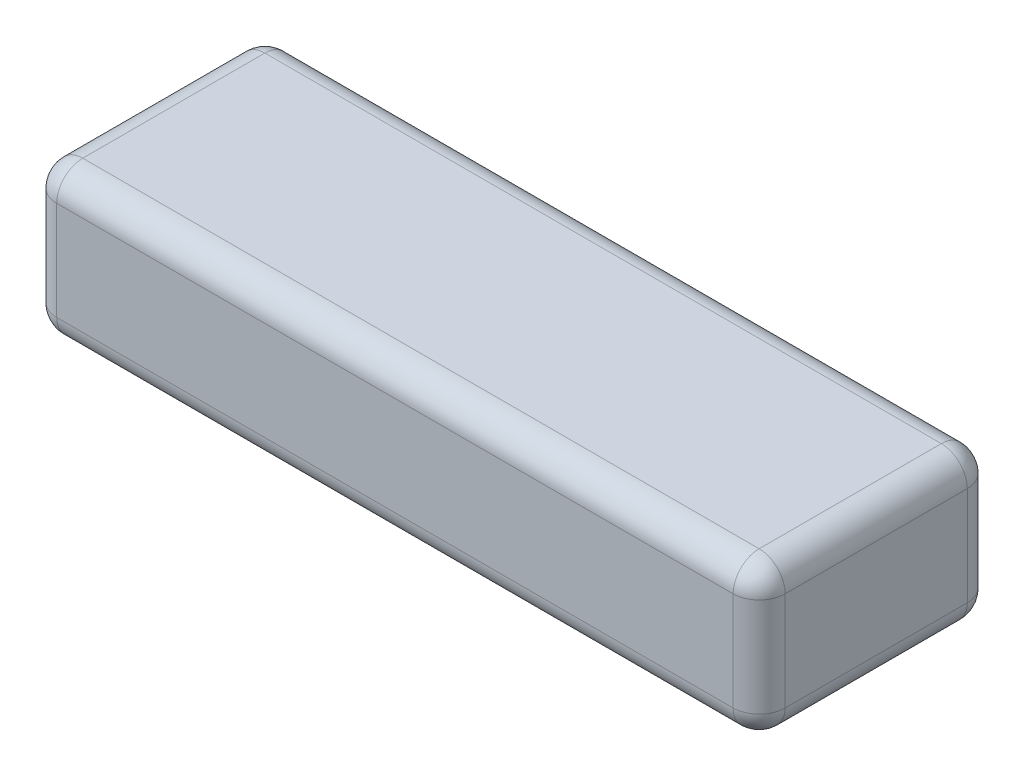
ISO-10303-21;
HEADER;
FILE_DESCRIPTION(('STEP AP214'),'2;1');
FILE_NAME('part.step','',(''),(''),'','','');
FILE_SCHEMA(('AUTOMOTIVE_DESIGN { 1 0 10303 214 1 1 1 1 }'));
ENDSEC;
DATA;
#1=APPLICATION_CONTEXT('core data for automotive mechanical design processes');
#2=APPLICATION_PROTOCOL_DEFINITION('international standard','automotive_design',2000,#1);
#3=PRODUCT_CONTEXT('',#1,'mechanical');
#4=PRODUCT('Part','Part','',(#3));
#5=PRODUCT_RELATED_PRODUCT_CATEGORY('part','',(#4));
#6=PRODUCT_DEFINITION_FORMATION('','',#4);
#7=PRODUCT_DEFINITION_CONTEXT('part definition',#1,'design');
#8=PRODUCT_DEFINITION('design','',#6,#7);
#9=PRODUCT_DEFINITION_SHAPE('','',#8);
#10=(LENGTH_UNIT() NAMED_UNIT(*) SI_UNIT(.MILLI.,.METRE.));
#11=(NAMED_UNIT(*) PLANE_ANGLE_UNIT() SI_UNIT($,.RADIAN.));
#12=(NAMED_UNIT(*) SI_UNIT($,.STERADIAN.) SOLID_ANGLE_UNIT());
#13=UNCERTAINTY_MEASURE_WITH_UNIT(LENGTH_MEASURE(1.E-05),#10,'distance_accuracy_value','');
#14=(GEOMETRIC_REPRESENTATION_CONTEXT(3) GLOBAL_UNCERTAINTY_ASSIGNED_CONTEXT((#13)) GLOBAL_UNIT_ASSIGNED_CONTEXT((#10,
#11,#12)) REPRESENTATION_CONTEXT('',''));
#15=CARTESIAN_POINT('',(0.,0.,0.));
#16=DIRECTION('',(0.,0.,1.));
#17=DIRECTION('',(1.,0.,0.));
#18=AXIS2_PLACEMENT_3D('',#15,#16,#17);
#19=CARTESIAN_POINT('',(-70.,29.,22.5));
#20=DIRECTION('',(1.,0.,0.));
#21=DIRECTION('',(0.,0.,-1.));
#22=AXIS2_PLACEMENT_3D('',#19,#20,#21);
#23=PLANE('',#22);
#24=DIRECTION('',(0.,0.,1.));
#25=VECTOR('',#24,1.);
#26=CARTESIAN_POINT('',(-70.,24.,-22.5));
#27=LINE('',#26,#25);
#28=CARTESIAN_POINT('',(-70.,24.,17.5));
#29=VERTEX_POINT('',#28);
#30=CARTESIAN_POINT('',(-70.,24.,-17.5));
#31=VERTEX_POINT('',#30);
#32=EDGE_CURVE('E276',#29,#31,#27,.F.);
#33=ORIENTED_EDGE('',*,*,#32,.T.);
#34=DIRECTION('',(0.,-1.,0.));
#35=VECTOR('',#34,1.);
#36=CARTESIAN_POINT('',(-70.,29.,-17.5));
#37=LINE('',#36,#35);
#38=CARTESIAN_POINT('',(-70.,5.,-17.5));
#39=VERTEX_POINT('',#38);
#40=EDGE_CURVE('E156',#31,#39,#37,.T.);
#41=ORIENTED_EDGE('',*,*,#40,.T.);
#42=DIRECTION('',(0.,0.,1.));
#43=VECTOR('',#42,1.);
#44=CARTESIAN_POINT('',(-70.,5.,22.5));
#45=LINE('',#44,#43);
#46=CARTESIAN_POINT('',(-70.,5.,17.5));
#47=VERTEX_POINT('',#46);
#48=EDGE_CURVE('E283',#39,#47,#45,.T.);
#49=ORIENTED_EDGE('',*,*,#48,.T.);
#50=DIRECTION('',(0.,-1.,0.));
#51=VECTOR('',#50,1.);
#52=CARTESIAN_POINT('',(-70.,29.,17.5));
#53=LINE('',#52,#51);
#54=EDGE_CURVE('E278',#47,#29,#53,.F.);
#55=ORIENTED_EDGE('',*,*,#54,.T.);
#56=EDGE_LOOP('',(#33,#41,#49,#55));
#57=FACE_BOUND('',#56,.T.);
#58=ADVANCED_FACE('F35',(#57),#23,.F.);
#59=CARTESIAN_POINT('',(70.,29.,22.5));
#60=DIRECTION('',(0.,0.,-1.));
#61=DIRECTION('',(-1.,0.,0.));
#62=AXIS2_PLACEMENT_3D('',#59,#60,#61);
#63=PLANE('',#62);
#64=DIRECTION('',(0.,-1.,0.));
#65=VECTOR('',#64,1.);
#66=CARTESIAN_POINT('',(-65.,29.,22.5));
#67=LINE('',#66,#65);
#68=CARTESIAN_POINT('',(-65.,24.,22.5));
#69=VERTEX_POINT('',#68);
#70=CARTESIAN_POINT('',(-65.,5.,22.5));
#71=VERTEX_POINT('',#70);
#72=EDGE_CURVE('E232',#69,#71,#67,.T.);
#73=ORIENTED_EDGE('',*,*,#72,.T.);
#74=DIRECTION('',(1.,0.,0.));
#75=VECTOR('',#74,1.);
#76=CARTESIAN_POINT('',(70.,5.,22.5));
#77=LINE('',#76,#75);
#78=CARTESIAN_POINT('',(65.,5.,22.5));
#79=VERTEX_POINT('',#78);
#80=EDGE_CURVE('E235',#71,#79,#77,.T.);
#81=ORIENTED_EDGE('',*,*,#80,.T.);
#82=DIRECTION('',(0.,-1.,0.));
#83=VECTOR('',#82,1.);
#84=CARTESIAN_POINT('',(65.,29.,22.5));
#85=LINE('',#84,#83);
#86=CARTESIAN_POINT('',(65.,24.,22.5));
#87=VERTEX_POINT('',#86);
#88=EDGE_CURVE('E214',#79,#87,#85,.F.);
#89=ORIENTED_EDGE('',*,*,#88,.T.);
#90=DIRECTION('',(1.,0.,0.));
#91=VECTOR('',#90,1.);
#92=CARTESIAN_POINT('',(-70.,24.,22.5));
#93=LINE('',#92,#91);
#94=EDGE_CURVE('E229',#87,#69,#93,.F.);
#95=ORIENTED_EDGE('',*,*,#94,.T.);
#96=EDGE_LOOP('',(#73,#81,#89,#95));
#97=FACE_BOUND('',#96,.T.);
#98=ADVANCED_FACE('F325',(#97),#63,.F.);
#99=CARTESIAN_POINT('',(70.,29.,22.5));
#100=DIRECTION('',(-1.,0.,0.));
#101=DIRECTION('',(0.,0.,1.));
#102=AXIS2_PLACEMENT_3D('',#99,#100,#101);
#103=PLANE('',#102);
#104=DIRECTION('',(0.,0.,-1.));
#105=VECTOR('',#104,1.);
#106=CARTESIAN_POINT('',(70.,5.,22.5));
#107=LINE('',#106,#105);
#108=CARTESIAN_POINT('',(70.,5.,17.5));
#109=VERTEX_POINT('',#108);
#110=CARTESIAN_POINT('',(70.,5.,-17.5));
#111=VERTEX_POINT('',#110);
#112=EDGE_CURVE('E219',#109,#111,#107,.T.);
#113=ORIENTED_EDGE('',*,*,#112,.T.);
#114=DIRECTION('',(0.,-1.,0.));
#115=VECTOR('',#114,1.);
#116=CARTESIAN_POINT('',(70.,29.,-17.5));
#117=LINE('',#116,#115);
#118=CARTESIAN_POINT('',(70.,24.,-17.5));
#119=VERTEX_POINT('',#118);
#120=EDGE_CURVE('E222',#111,#119,#117,.F.);
#121=ORIENTED_EDGE('',*,*,#120,.T.);
#122=DIRECTION('',(0.,0.,-1.));
#123=VECTOR('',#122,1.);
#124=CARTESIAN_POINT('',(70.,24.,22.5));
#125=LINE('',#124,#123);
#126=CARTESIAN_POINT('',(70.,24.,17.5));
#127=VERTEX_POINT('',#126);
#128=EDGE_CURVE('E220',#119,#127,#125,.F.);
#129=ORIENTED_EDGE('',*,*,#128,.T.);
#130=DIRECTION('',(0.,-1.,0.));
#131=VECTOR('',#130,1.);
#132=CARTESIAN_POINT('',(70.,29.,17.5));
#133=LINE('',#132,#131);
#134=EDGE_CURVE('E216',#127,#109,#133,.T.);
#135=ORIENTED_EDGE('',*,*,#134,.T.);
#136=EDGE_LOOP('',(#113,#121,#129,#135));
#137=FACE_BOUND('',#136,.T.);
#138=ADVANCED_FACE('F329',(#137),#103,.F.);
#139=CARTESIAN_POINT('',(70.,29.,-22.5));
#140=DIRECTION('',(0.,0.,1.));
#141=DIRECTION('',(1.,0.,0.));
#142=AXIS2_PLACEMENT_3D('',#139,#140,#141);
#143=PLANE('',#142);
#144=DIRECTION('',(0.,-1.,0.));
#145=VECTOR('',#144,1.);
#146=CARTESIAN_POINT('',(65.,29.,-22.5));
#147=LINE('',#146,#145);
#148=CARTESIAN_POINT('',(65.,24.,-22.5));
#149=VERTEX_POINT('',#148);
#150=CARTESIAN_POINT('',(65.,5.,-22.5));
#151=VERTEX_POINT('',#150);
#152=EDGE_CURVE('E134',#149,#151,#147,.T.);
#153=ORIENTED_EDGE('',*,*,#152,.T.);
#154=DIRECTION('',(-1.,0.,0.));
#155=VECTOR('',#154,1.);
#156=CARTESIAN_POINT('',(70.,5.,-22.5));
#157=LINE('',#156,#155);
#158=CARTESIAN_POINT('',(-65.,5.,-22.5));
#159=VERTEX_POINT('',#158);
#160=EDGE_CURVE('E130',#151,#159,#157,.T.);
#161=ORIENTED_EDGE('',*,*,#160,.T.);
#162=DIRECTION('',(0.,-1.,0.));
#163=VECTOR('',#162,1.);
#164=CARTESIAN_POINT('',(-65.,29.,-22.5));
#165=LINE('',#164,#163);
#166=CARTESIAN_POINT('',(-65.,24.,-22.5));
#167=VERTEX_POINT('',#166);
#168=EDGE_CURVE('E124',#159,#167,#165,.F.);
#169=ORIENTED_EDGE('',*,*,#168,.T.);
#170=DIRECTION('',(-1.,0.,0.));
#171=VECTOR('',#170,1.);
#172=CARTESIAN_POINT('',(70.,24.,-22.5));
#173=LINE('',#172,#171);
#174=EDGE_CURVE('E127',#167,#149,#173,.F.);
#175=ORIENTED_EDGE('',*,*,#174,.T.);
#176=EDGE_LOOP('',(#153,#161,#169,#175));
#177=FACE_BOUND('',#176,.T.);
#178=ADVANCED_FACE('F126',(#177),#143,.F.);
#179=CARTESIAN_POINT('',(0.,29.,0.));
#180=DIRECTION('',(0.,1.,0.));
#181=DIRECTION('',(0.,0.,1.));
#182=AXIS2_PLACEMENT_3D('',#179,#180,#181);
#183=PLANE('',#182);
#184=DIRECTION('',(0.,0.,-1.));
#185=VECTOR('',#184,1.);
#186=CARTESIAN_POINT('',(65.,29.,-22.5));
#187=LINE('',#186,#185);
#188=CARTESIAN_POINT('',(65.,29.,17.5));
#189=VERTEX_POINT('',#188);
#190=CARTESIAN_POINT('',(65.,29.,-17.5));
#191=VERTEX_POINT('',#190);
#192=EDGE_CURVE('E44',#189,#191,#187,.T.);
#193=ORIENTED_EDGE('',*,*,#192,.T.);
#194=DIRECTION('',(-1.,0.,0.));
#195=VECTOR('',#194,1.);
#196=CARTESIAN_POINT('',(-70.,29.,-17.5));
#197=LINE('',#196,#195);
#198=CARTESIAN_POINT('',(-65.,29.,-17.5));
#199=VERTEX_POINT('',#198);
#200=EDGE_CURVE('E11',#191,#199,#197,.T.);
#201=ORIENTED_EDGE('',*,*,#200,.T.);
#202=DIRECTION('',(0.,0.,1.));
#203=VECTOR('',#202,1.);
#204=CARTESIAN_POINT('',(-65.,29.,22.5));
#205=LINE('',#204,#203);
#206=CARTESIAN_POINT('',(-65.,29.,17.5));
#207=VERTEX_POINT('',#206);
#208=EDGE_CURVE('E237',#199,#207,#205,.T.);
#209=ORIENTED_EDGE('',*,*,#208,.T.);
#210=DIRECTION('',(1.,0.,0.));
#211=VECTOR('',#210,1.);
#212=CARTESIAN_POINT('',(70.,29.,17.5));
#213=LINE('',#212,#211);
#214=EDGE_CURVE('E55',#207,#189,#213,.T.);
#215=ORIENTED_EDGE('',*,*,#214,.T.);
#216=EDGE_LOOP('',(#193,#201,#209,#215));
#217=FACE_BOUND('',#216,.T.);
#218=ADVANCED_FACE('F290',(#217),#183,.T.);
#219=CARTESIAN_POINT('',(0.,0.,0.));
#220=DIRECTION('',(0.,1.,0.));
#221=DIRECTION('',(0.,0.,1.));
#222=AXIS2_PLACEMENT_3D('',#219,#220,#221);
#223=PLANE('',#222);
#224=DIRECTION('',(0.,0.,1.));
#225=VECTOR('',#224,1.);
#226=CARTESIAN_POINT('',(-65.,0.,0.));
#227=LINE('',#226,#225);
#228=CARTESIAN_POINT('',(-65.,0.,17.5));
#229=VERTEX_POINT('',#228);
#230=CARTESIAN_POINT('',(-65.,0.,-17.5));
#231=VERTEX_POINT('',#230);
#232=EDGE_CURVE('E266',#229,#231,#227,.F.);
#233=ORIENTED_EDGE('',*,*,#232,.T.);
#234=DIRECTION('',(-1.,0.,0.));
#235=VECTOR('',#234,1.);
#236=CARTESIAN_POINT('',(0.,0.,-17.5));
#237=LINE('',#236,#235);
#238=CARTESIAN_POINT('',(65.,0.,-17.5));
#239=VERTEX_POINT('',#238);
#240=EDGE_CURVE('E270',#231,#239,#237,.F.);
#241=ORIENTED_EDGE('',*,*,#240,.T.);
#242=DIRECTION('',(0.,0.,-1.));
#243=VECTOR('',#242,1.);
#244=CARTESIAN_POINT('',(65.,0.,0.));
#245=LINE('',#244,#243);
#246=CARTESIAN_POINT('',(65.,0.,17.5));
#247=VERTEX_POINT('',#246);
#248=EDGE_CURVE('E261',#239,#247,#245,.F.);
#249=ORIENTED_EDGE('',*,*,#248,.T.);
#250=DIRECTION('',(1.,0.,0.));
#251=VECTOR('',#250,1.);
#252=CARTESIAN_POINT('',(0.,0.,17.5));
#253=LINE('',#252,#251);
#254=EDGE_CURVE('E267',#247,#229,#253,.F.);
#255=ORIENTED_EDGE('',*,*,#254,.T.);
#256=EDGE_LOOP('',(#233,#241,#249,#255));
#257=FACE_BOUND('',#256,.T.);
#258=ADVANCED_FACE('F271',(#257),#223,.F.);
#259=CARTESIAN_POINT('',(0.,24.,17.5));
#260=DIRECTION('',(-1.,0.,0.));
#261=DIRECTION('',(0.,0.,1.));
#262=AXIS2_PLACEMENT_3D('',#259,#260,#261);
#263=CYLINDRICAL_SURFACE('',#262,5.);
#264=CARTESIAN_POINT('',(65.,24.,17.5));
#265=DIRECTION('',(1.,0.,0.));
#266=DIRECTION('',(0.,0.,-1.));
#267=AXIS2_PLACEMENT_3D('',#264,#265,#266);
#268=CIRCLE('',#267,5.);
#269=EDGE_CURVE('E39',#189,#87,#268,.T.);
#270=ORIENTED_EDGE('',*,*,#269,.F.);
#271=ORIENTED_EDGE('',*,*,#214,.F.);
#272=CARTESIAN_POINT('',(-65.,24.,17.5));
#273=DIRECTION('',(-1.,0.,0.));
#274=DIRECTION('',(0.,0.,1.));
#275=AXIS2_PLACEMENT_3D('',#272,#273,#274);
#276=CIRCLE('',#275,5.);
#277=EDGE_CURVE('E196',#69,#207,#276,.T.);
#278=ORIENTED_EDGE('',*,*,#277,.F.);
#279=ORIENTED_EDGE('',*,*,#94,.F.);
#280=EDGE_LOOP('',(#270,#271,#278,#279));
#281=FACE_BOUND('',#280,.T.);
#282=ADVANCED_FACE('F37',(#281),#263,.T.);
#283=CARTESIAN_POINT('',(65.,24.,17.5));
#284=DIRECTION('',(0.,0.,1.));
#285=DIRECTION('',(1.,0.,0.));
#286=AXIS2_PLACEMENT_3D('',#283,#284,#285);
#287=SPHERICAL_SURFACE('',#286,5.);
#288=CARTESIAN_POINT('',(65.,24.,17.5));
#289=DIRECTION('',(0.,0.,1.));
#290=DIRECTION('',(1.,0.,0.));
#291=AXIS2_PLACEMENT_3D('',#288,#289,#290);
#292=CIRCLE('',#291,5.);
#293=EDGE_CURVE('E191',#189,#127,#292,.F.);
#294=ORIENTED_EDGE('',*,*,#293,.F.);
#295=ORIENTED_EDGE('',*,*,#269,.T.);
#296=CARTESIAN_POINT('',(65.,24.,17.5));
#297=DIRECTION('',(0.,1.,0.));
#298=DIRECTION('',(0.,0.,1.));
#299=AXIS2_PLACEMENT_3D('',#296,#297,#298);
#300=CIRCLE('',#299,5.);
#301=EDGE_CURVE('E194',#127,#87,#300,.F.);
#302=ORIENTED_EDGE('',*,*,#301,.F.);
#303=EDGE_LOOP('',(#294,#295,#302));
#304=FACE_BOUND('',#303,.T.);
#305=ADVANCED_FACE('F206',(#304),#287,.T.);
#306=CARTESIAN_POINT('',(-65.,24.,17.5));
#307=DIRECTION('',(0.,0.,1.));
#308=DIRECTION('',(1.,0.,0.));
#309=AXIS2_PLACEMENT_3D('',#306,#307,#308);
#310=SPHERICAL_SURFACE('',#309,5.);
#311=CARTESIAN_POINT('',(-65.,24.,17.5));
#312=DIRECTION('',(0.,1.,0.));
#313=DIRECTION('',(0.,0.,1.));
#314=AXIS2_PLACEMENT_3D('',#311,#312,#313);
#315=CIRCLE('',#314,5.);
#316=EDGE_CURVE('E185',#69,#29,#315,.F.);
#317=ORIENTED_EDGE('',*,*,#316,.F.);
#318=ORIENTED_EDGE('',*,*,#277,.T.);
#319=CARTESIAN_POINT('',(-65.,24.,17.5));
#320=DIRECTION('',(0.,0.,1.));
#321=DIRECTION('',(1.,0.,0.));
#322=AXIS2_PLACEMENT_3D('',#319,#320,#321);
#323=CIRCLE('',#322,5.);
#324=EDGE_CURVE('E188',#29,#207,#323,.F.);
#325=ORIENTED_EDGE('',*,*,#324,.F.);
#326=EDGE_LOOP('',(#317,#318,#325));
#327=FACE_BOUND('',#326,.T.);
#328=ADVANCED_FACE('F359',(#327),#310,.T.);
#329=CARTESIAN_POINT('',(65.,29.,17.5));
#330=DIRECTION('',(0.,-1.,0.));
#331=DIRECTION('',(0.,0.,-1.));
#332=AXIS2_PLACEMENT_3D('',#329,#330,#331);
#333=CYLINDRICAL_SURFACE('',#332,5.);
#334=ORIENTED_EDGE('',*,*,#301,.T.);
#335=ORIENTED_EDGE('',*,*,#88,.F.);
#336=CARTESIAN_POINT('',(65.,5.,17.5));
#337=DIRECTION('',(0.,-1.,0.));
#338=DIRECTION('',(0.,0.,-1.));
#339=AXIS2_PLACEMENT_3D('',#336,#337,#338);
#340=CIRCLE('',#339,5.);
#341=EDGE_CURVE('E179',#109,#79,#340,.T.);
#342=ORIENTED_EDGE('',*,*,#341,.F.);
#343=ORIENTED_EDGE('',*,*,#134,.F.);
#344=EDGE_LOOP('',(#334,#335,#342,#343));
#345=FACE_BOUND('',#344,.T.);
#346=ADVANCED_FACE('F212',(#345),#333,.T.);
#347=CARTESIAN_POINT('',(65.,24.,0.));
#348=DIRECTION('',(0.,0.,1.));
#349=DIRECTION('',(1.,0.,0.));
#350=AXIS2_PLACEMENT_3D('',#347,#348,#349);
#351=CYLINDRICAL_SURFACE('',#350,5.);
#352=ORIENTED_EDGE('',*,*,#293,.T.);
#353=ORIENTED_EDGE('',*,*,#128,.F.);
#354=CARTESIAN_POINT('',(65.,24.,-17.5));
#355=DIRECTION('',(0.,0.,-1.));
#356=DIRECTION('',(-1.,0.,0.));
#357=AXIS2_PLACEMENT_3D('',#354,#355,#356);
#358=CIRCLE('',#357,5.);
#359=EDGE_CURVE('E176',#191,#119,#358,.T.);
#360=ORIENTED_EDGE('',*,*,#359,.F.);
#361=ORIENTED_EDGE('',*,*,#192,.F.);
#362=EDGE_LOOP('',(#352,#353,#360,#361));
#363=FACE_BOUND('',#362,.T.);
#364=ADVANCED_FACE('F294',(#363),#351,.T.);
#365=CARTESIAN_POINT('',(0.,24.,-17.5));
#366=DIRECTION('',(1.,0.,0.));
#367=DIRECTION('',(0.,0.,-1.));
#368=AXIS2_PLACEMENT_3D('',#365,#366,#367);
#369=CYLINDRICAL_SURFACE('',#368,5.);
#370=CARTESIAN_POINT('',(-65.,24.,-17.5));
#371=DIRECTION('',(-1.,0.,0.));
#372=DIRECTION('',(0.,0.,1.));
#373=AXIS2_PLACEMENT_3D('',#370,#371,#372);
#374=CIRCLE('',#373,5.);
#375=EDGE_CURVE('E140',#199,#167,#374,.T.);
#376=ORIENTED_EDGE('',*,*,#375,.F.);
#377=ORIENTED_EDGE('',*,*,#200,.F.);
#378=CARTESIAN_POINT('',(65.,24.,-17.5));
#379=DIRECTION('',(1.,0.,0.));
#380=DIRECTION('',(0.,0.,-1.));
#381=AXIS2_PLACEMENT_3D('',#378,#379,#380);
#382=CIRCLE('',#381,5.);
#383=EDGE_CURVE('E143',#149,#191,#382,.T.);
#384=ORIENTED_EDGE('',*,*,#383,.F.);
#385=ORIENTED_EDGE('',*,*,#174,.F.);
#386=EDGE_LOOP('',(#376,#377,#384,#385));
#387=FACE_BOUND('',#386,.T.);
#388=ADVANCED_FACE('F139',(#387),#369,.T.);
#389=CARTESIAN_POINT('',(-65.,24.,0.));
#390=DIRECTION('',(0.,0.,-1.));
#391=DIRECTION('',(-1.,0.,0.));
#392=AXIS2_PLACEMENT_3D('',#389,#390,#391);
#393=CYLINDRICAL_SURFACE('',#392,5.);
#394=ORIENTED_EDGE('',*,*,#324,.T.);
#395=ORIENTED_EDGE('',*,*,#208,.F.);
#396=CARTESIAN_POINT('',(-65.,24.,-17.5));
#397=DIRECTION('',(0.,0.,-1.));
#398=DIRECTION('',(0.,1.,0.));
#399=AXIS2_PLACEMENT_3D('',#396,#397,#398);
#400=CIRCLE('',#399,5.);
#401=EDGE_CURVE('E152',#31,#199,#400,.T.);
#402=ORIENTED_EDGE('',*,*,#401,.F.);
#403=ORIENTED_EDGE('',*,*,#32,.F.);
#404=EDGE_LOOP('',(#394,#395,#402,#403));
#405=FACE_BOUND('',#404,.T.);
#406=ADVANCED_FACE('F289',(#405),#393,.T.);
#407=CARTESIAN_POINT('',(-65.,29.,17.5));
#408=DIRECTION('',(0.,-1.,0.));
#409=DIRECTION('',(0.,0.,-1.));
#410=AXIS2_PLACEMENT_3D('',#407,#408,#409);
#411=CYLINDRICAL_SURFACE('',#410,5.);
#412=ORIENTED_EDGE('',*,*,#316,.T.);
#413=ORIENTED_EDGE('',*,*,#54,.F.);
#414=CARTESIAN_POINT('',(-65.,5.,17.5));
#415=DIRECTION('',(0.,-1.,0.));
#416=DIRECTION('',(0.,0.,-1.));
#417=AXIS2_PLACEMENT_3D('',#414,#415,#416);
#418=CIRCLE('',#417,5.);
#419=EDGE_CURVE('E171',#71,#47,#418,.T.);
#420=ORIENTED_EDGE('',*,*,#419,.F.);
#421=ORIENTED_EDGE('',*,*,#72,.F.);
#422=EDGE_LOOP('',(#412,#413,#420,#421));
#423=FACE_BOUND('',#422,.T.);
#424=ADVANCED_FACE('F389',(#423),#411,.T.);
#425=CARTESIAN_POINT('',(70.,5.,17.5));
#426=DIRECTION('',(1.,0.,0.));
#427=DIRECTION('',(0.,0.,-1.));
#428=AXIS2_PLACEMENT_3D('',#425,#426,#427);
#429=CYLINDRICAL_SURFACE('',#428,5.);
#430=CARTESIAN_POINT('',(65.,5.,17.5));
#431=DIRECTION('',(1.,0.,0.));
#432=DIRECTION('',(0.,0.,-1.));
#433=AXIS2_PLACEMENT_3D('',#430,#431,#432);
#434=CIRCLE('',#433,5.);
#435=EDGE_CURVE('E182',#79,#247,#434,.T.);
#436=ORIENTED_EDGE('',*,*,#435,.F.);
#437=ORIENTED_EDGE('',*,*,#80,.F.);
#438=CARTESIAN_POINT('',(-65.,5.,17.5));
#439=DIRECTION('',(-1.,0.,0.));
#440=DIRECTION('',(0.,0.,1.));
#441=AXIS2_PLACEMENT_3D('',#438,#439,#440);
#442=CIRCLE('',#441,5.);
#443=EDGE_CURVE('E169',#229,#71,#442,.T.);
#444=ORIENTED_EDGE('',*,*,#443,.F.);
#445=ORIENTED_EDGE('',*,*,#254,.F.);
#446=EDGE_LOOP('',(#436,#437,#444,#445));
#447=FACE_BOUND('',#446,.T.);
#448=ADVANCED_FACE('F308',(#447),#429,.T.);
#449=CARTESIAN_POINT('',(65.,5.,17.5));
#450=DIRECTION('',(0.,0.,1.));
#451=DIRECTION('',(1.,0.,0.));
#452=AXIS2_PLACEMENT_3D('',#449,#450,#451);
#453=SPHERICAL_SURFACE('',#452,5.);
#454=ORIENTED_EDGE('',*,*,#341,.T.);
#455=ORIENTED_EDGE('',*,*,#435,.T.);
#456=CARTESIAN_POINT('',(65.,5.,17.5));
#457=DIRECTION('',(0.,0.,1.));
#458=DIRECTION('',(1.,0.,0.));
#459=AXIS2_PLACEMENT_3D('',#456,#457,#458);
#460=CIRCLE('',#459,5.);
#461=EDGE_CURVE('E160',#109,#247,#460,.F.);
#462=ORIENTED_EDGE('',*,*,#461,.F.);
#463=EDGE_LOOP('',(#454,#455,#462));
#464=FACE_BOUND('',#463,.T.);
#465=ADVANCED_FACE('F403',(#464),#453,.T.);
#466=CARTESIAN_POINT('',(65.,24.,-17.5));
#467=DIRECTION('',(0.,0.,1.));
#468=DIRECTION('',(1.,0.,0.));
#469=AXIS2_PLACEMENT_3D('',#466,#467,#468);
#470=SPHERICAL_SURFACE('',#469,5.);
#471=ORIENTED_EDGE('',*,*,#383,.T.);
#472=ORIENTED_EDGE('',*,*,#359,.T.);
#473=CARTESIAN_POINT('',(65.,24.,-17.5));
#474=DIRECTION('',(0.,1.,0.));
#475=DIRECTION('',(0.,0.,1.));
#476=AXIS2_PLACEMENT_3D('',#473,#474,#475);
#477=CIRCLE('',#476,5.);
#478=EDGE_CURVE('E157',#149,#119,#477,.F.);
#479=ORIENTED_EDGE('',*,*,#478,.F.);
#480=EDGE_LOOP('',(#471,#472,#479));
#481=FACE_BOUND('',#480,.T.);
#482=ADVANCED_FACE('F296',(#481),#470,.T.);
#483=CARTESIAN_POINT('',(-65.,24.,-17.5));
#484=DIRECTION('',(0.,0.,1.));
#485=DIRECTION('',(1.,0.,0.));
#486=AXIS2_PLACEMENT_3D('',#483,#484,#485);
#487=SPHERICAL_SURFACE('',#486,5.);
#488=ORIENTED_EDGE('',*,*,#401,.T.);
#489=ORIENTED_EDGE('',*,*,#375,.T.);
#490=CARTESIAN_POINT('',(-65.,24.,-17.5));
#491=DIRECTION('',(0.,1.,0.));
#492=DIRECTION('',(0.,0.,1.));
#493=AXIS2_PLACEMENT_3D('',#490,#491,#492);
#494=CIRCLE('',#493,5.);
#495=EDGE_CURVE('E149',#31,#167,#494,.F.);
#496=ORIENTED_EDGE('',*,*,#495,.F.);
#497=EDGE_LOOP('',(#488,#489,#496));
#498=FACE_BOUND('',#497,.T.);
#499=ADVANCED_FACE('F148',(#498),#487,.T.);
#500=CARTESIAN_POINT('',(-65.,5.,17.5));
#501=DIRECTION('',(0.,0.,1.));
#502=DIRECTION('',(1.,0.,0.));
#503=AXIS2_PLACEMENT_3D('',#500,#501,#502);
#504=SPHERICAL_SURFACE('',#503,5.);
#505=ORIENTED_EDGE('',*,*,#443,.T.);
#506=ORIENTED_EDGE('',*,*,#419,.T.);
#507=CARTESIAN_POINT('',(-65.,5.,17.5));
#508=DIRECTION('',(0.,0.,1.));
#509=DIRECTION('',(1.,0.,0.));
#510=AXIS2_PLACEMENT_3D('',#507,#508,#509);
#511=CIRCLE('',#510,5.);
#512=EDGE_CURVE('E158',#229,#47,#511,.F.);
#513=ORIENTED_EDGE('',*,*,#512,.F.);
#514=EDGE_LOOP('',(#505,#506,#513));
#515=FACE_BOUND('',#514,.T.);
#516=ADVANCED_FACE('F311',(#515),#504,.T.);
#517=CARTESIAN_POINT('',(65.,5.,22.5));
#518=DIRECTION('',(0.,0.,-1.));
#519=DIRECTION('',(-1.,0.,0.));
#520=AXIS2_PLACEMENT_3D('',#517,#518,#519);
#521=CYLINDRICAL_SURFACE('',#520,5.);
#522=ORIENTED_EDGE('',*,*,#461,.T.);
#523=ORIENTED_EDGE('',*,*,#248,.F.);
#524=CARTESIAN_POINT('',(65.,5.,-17.5));
#525=DIRECTION('',(0.,0.,-1.));
#526=DIRECTION('',(-1.,0.,0.));
#527=AXIS2_PLACEMENT_3D('',#524,#525,#526);
#528=CIRCLE('',#527,5.);
#529=EDGE_CURVE('E163',#111,#239,#528,.T.);
#530=ORIENTED_EDGE('',*,*,#529,.F.);
#531=ORIENTED_EDGE('',*,*,#112,.F.);
#532=EDGE_LOOP('',(#522,#523,#530,#531));
#533=FACE_BOUND('',#532,.T.);
#534=ADVANCED_FACE('F263',(#533),#521,.T.);
#535=CARTESIAN_POINT('',(65.,29.,-17.5));
#536=DIRECTION('',(0.,-1.,0.));
#537=DIRECTION('',(0.,0.,-1.));
#538=AXIS2_PLACEMENT_3D('',#535,#536,#537);
#539=CYLINDRICAL_SURFACE('',#538,5.);
#540=ORIENTED_EDGE('',*,*,#478,.T.);
#541=ORIENTED_EDGE('',*,*,#120,.F.);
#542=CARTESIAN_POINT('',(65.,5.,-17.5));
#543=DIRECTION('',(0.,-1.,0.));
#544=DIRECTION('',(0.,0.,-1.));
#545=AXIS2_PLACEMENT_3D('',#542,#543,#544);
#546=CIRCLE('',#545,5.);
#547=EDGE_CURVE('E250',#151,#111,#546,.T.);
#548=ORIENTED_EDGE('',*,*,#547,.F.);
#549=ORIENTED_EDGE('',*,*,#152,.F.);
#550=EDGE_LOOP('',(#540,#541,#548,#549));
#551=FACE_BOUND('',#550,.T.);
#552=ADVANCED_FACE('F300',(#551),#539,.T.);
#553=CARTESIAN_POINT('',(-65.,29.,-17.5));
#554=DIRECTION('',(0.,-1.,0.));
#555=DIRECTION('',(0.,0.,-1.));
#556=AXIS2_PLACEMENT_3D('',#553,#554,#555);
#557=CYLINDRICAL_SURFACE('',#556,5.);
#558=ORIENTED_EDGE('',*,*,#495,.T.);
#559=ORIENTED_EDGE('',*,*,#168,.F.);
#560=CARTESIAN_POINT('',(-65.,5.,-17.5));
#561=DIRECTION('',(0.,-1.,0.));
#562=DIRECTION('',(0.,0.,-1.));
#563=AXIS2_PLACEMENT_3D('',#560,#561,#562);
#564=CIRCLE('',#563,5.);
#565=EDGE_CURVE('E247',#39,#159,#564,.T.);
#566=ORIENTED_EDGE('',*,*,#565,.F.);
#567=ORIENTED_EDGE('',*,*,#40,.F.);
#568=EDGE_LOOP('',(#558,#559,#566,#567));
#569=FACE_BOUND('',#568,.T.);
#570=ADVANCED_FACE('F154',(#569),#557,.T.);
#571=CARTESIAN_POINT('',(-65.,5.,22.5));
#572=DIRECTION('',(0.,0.,1.));
#573=DIRECTION('',(1.,0.,0.));
#574=AXIS2_PLACEMENT_3D('',#571,#572,#573);
#575=CYLINDRICAL_SURFACE('',#574,5.);
#576=ORIENTED_EDGE('',*,*,#512,.T.);
#577=ORIENTED_EDGE('',*,*,#48,.F.);
#578=CARTESIAN_POINT('',(-65.,5.,-17.5));
#579=DIRECTION('',(0.,0.,-1.));
#580=DIRECTION('',(-1.,0.,0.));
#581=AXIS2_PLACEMENT_3D('',#578,#579,#580);
#582=CIRCLE('',#581,5.);
#583=EDGE_CURVE('E245',#231,#39,#582,.T.);
#584=ORIENTED_EDGE('',*,*,#583,.F.);
#585=ORIENTED_EDGE('',*,*,#232,.F.);
#586=EDGE_LOOP('',(#576,#577,#584,#585));
#587=FACE_BOUND('',#586,.T.);
#588=ADVANCED_FACE('F313',(#587),#575,.T.);
#589=CARTESIAN_POINT('',(65.,5.,-17.5));
#590=DIRECTION('',(0.,0.,1.));
#591=DIRECTION('',(1.,0.,0.));
#592=AXIS2_PLACEMENT_3D('',#589,#590,#591);
#593=SPHERICAL_SURFACE('',#592,5.);
#594=ORIENTED_EDGE('',*,*,#547,.T.);
#595=ORIENTED_EDGE('',*,*,#529,.T.);
#596=CARTESIAN_POINT('',(65.,5.,-17.5));
#597=DIRECTION('',(1.,0.,0.));
#598=DIRECTION('',(0.,0.,-1.));
#599=AXIS2_PLACEMENT_3D('',#596,#597,#598);
#600=CIRCLE('',#599,5.);
#601=EDGE_CURVE('E243',#151,#239,#600,.F.);
#602=ORIENTED_EDGE('',*,*,#601,.F.);
#603=EDGE_LOOP('',(#594,#595,#602));
#604=FACE_BOUND('',#603,.T.);
#605=ADVANCED_FACE('F257',(#604),#593,.T.);
#606=CARTESIAN_POINT('',(-65.,5.,-17.5));
#607=DIRECTION('',(0.,0.,1.));
#608=DIRECTION('',(1.,0.,0.));
#609=AXIS2_PLACEMENT_3D('',#606,#607,#608);
#610=SPHERICAL_SURFACE('',#609,5.);
#611=ORIENTED_EDGE('',*,*,#583,.T.);
#612=ORIENTED_EDGE('',*,*,#565,.T.);
#613=CARTESIAN_POINT('',(-65.,5.,-17.5));
#614=DIRECTION('',(-1.,0.,0.));
#615=DIRECTION('',(0.,0.,1.));
#616=AXIS2_PLACEMENT_3D('',#613,#614,#615);
#617=CIRCLE('',#616,5.);
#618=EDGE_CURVE('E241',#231,#159,#617,.F.);
#619=ORIENTED_EDGE('',*,*,#618,.F.);
#620=EDGE_LOOP('',(#611,#612,#619));
#621=FACE_BOUND('',#620,.T.);
#622=ADVANCED_FACE('F315',(#621),#610,.T.);
#623=CARTESIAN_POINT('',(70.,5.,-17.5));
#624=DIRECTION('',(-1.,0.,0.));
#625=DIRECTION('',(0.,0.,1.));
#626=AXIS2_PLACEMENT_3D('',#623,#624,#625);
#627=CYLINDRICAL_SURFACE('',#626,5.);
#628=ORIENTED_EDGE('',*,*,#601,.T.);
#629=ORIENTED_EDGE('',*,*,#240,.F.);
#630=ORIENTED_EDGE('',*,*,#618,.T.);
#631=ORIENTED_EDGE('',*,*,#160,.F.);
#632=EDGE_LOOP('',(#628,#629,#630,#631));
#633=FACE_BOUND('',#632,.T.);
#634=ADVANCED_FACE('F316',(#633),#627,.T.);
#635=CLOSED_SHELL('',(#58,#98,#138,#178,#218,#258,#282,#305,#328,#346,#364,#388,#406,#424,#448,
#465,#482,#499,#516,#534,#552,#570,#588,#605,#622,#634));
#636=MANIFOLD_SOLID_BREP('B2',#635);
#637=ADVANCED_BREP_SHAPE_REPRESENTATION('',(#18,#636),#14);
#638=SHAPE_DEFINITION_REPRESENTATION(#9,#637);
ENDSEC;
END-ISO-10303-21;
